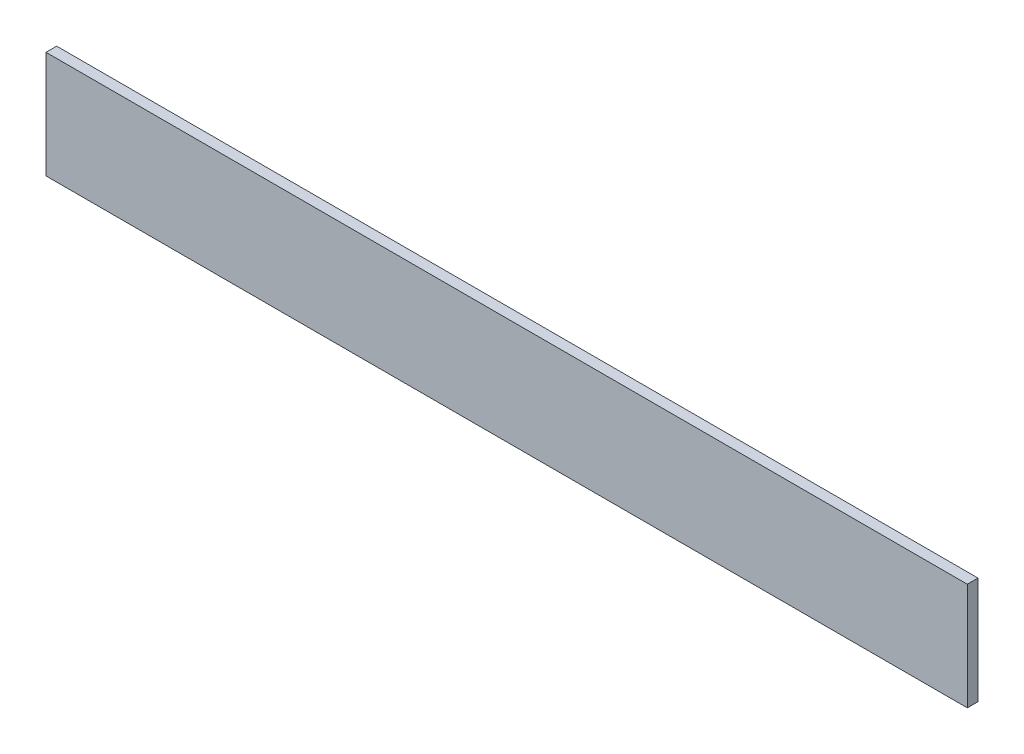
ISO-10303-21;
HEADER;
FILE_DESCRIPTION(('STEP AP214'),'2;1');
FILE_NAME('part.step','',(''),(''),'','','');
FILE_SCHEMA(('AUTOMOTIVE_DESIGN { 1 0 10303 214 1 1 1 1 }'));
ENDSEC;
DATA;
#1=APPLICATION_CONTEXT('core data for automotive mechanical design processes');
#2=APPLICATION_PROTOCOL_DEFINITION('international standard','automotive_design',2000,#1);
#3=PRODUCT_CONTEXT('',#1,'mechanical');
#4=PRODUCT('Part','Part','',(#3));
#5=PRODUCT_RELATED_PRODUCT_CATEGORY('part','',(#4));
#6=PRODUCT_DEFINITION_FORMATION('','',#4);
#7=PRODUCT_DEFINITION_CONTEXT('part definition',#1,'design');
#8=PRODUCT_DEFINITION('design','',#6,#7);
#9=PRODUCT_DEFINITION_SHAPE('','',#8);
#10=(LENGTH_UNIT() NAMED_UNIT(*) SI_UNIT(.MILLI.,.METRE.));
#11=(NAMED_UNIT(*) PLANE_ANGLE_UNIT() SI_UNIT($,.RADIAN.));
#12=(NAMED_UNIT(*) SI_UNIT($,.STERADIAN.) SOLID_ANGLE_UNIT());
#13=UNCERTAINTY_MEASURE_WITH_UNIT(LENGTH_MEASURE(1.E-05),#10,'distance_accuracy_value','');
#14=(GEOMETRIC_REPRESENTATION_CONTEXT(3) GLOBAL_UNCERTAINTY_ASSIGNED_CONTEXT((#13)) GLOBAL_UNIT_ASSIGNED_CONTEXT((#10,
#11,#12)) REPRESENTATION_CONTEXT('',''));
#15=CARTESIAN_POINT('',(0.,0.,0.));
#16=DIRECTION('',(0.,0.,1.));
#17=DIRECTION('',(1.,0.,0.));
#18=AXIS2_PLACEMENT_3D('',#15,#16,#17);
#19=CARTESIAN_POINT('',(32.574920494297,13.734089114766,2.64));
#20=DIRECTION('',(0.,0.,1.));
#21=DIRECTION('',(1.,0.,0.));
#22=AXIS2_PLACEMENT_3D('',#19,#20,#21);
#23=PLANE('',#22);
#24=DIRECTION('',(0.,1.,0.));
#25=VECTOR('',#24,1.);
#26=CARTESIAN_POINT('',(33.257948622599,17.610423854585,2.64));
#27=LINE('',#26,#25);
#28=CARTESIAN_POINT('',(33.257948622599,17.660573552284,2.64));
#29=VERTEX_POINT('',#28);
#30=CARTESIAN_POINT('',(33.257948622599,17.560274156885,2.64));
#31=VERTEX_POINT('',#30);
#32=EDGE_CURVE('E80',#29,#31,#27,.F.);
#33=ORIENTED_EDGE('',*,*,#32,.T.);
#34=DIRECTION('',(1.,0.,0.));
#35=VECTOR('',#34,1.);
#36=CARTESIAN_POINT('',(32.826434557084,17.560274156885,2.64));
#37=LINE('',#36,#35);
#38=CARTESIAN_POINT('',(32.394920491568,17.560274156885,2.64));
#39=VERTEX_POINT('',#38);
#40=EDGE_CURVE('E55',#31,#39,#37,.F.);
#41=ORIENTED_EDGE('',*,*,#40,.T.);
#42=DIRECTION('',(0.,1.,0.));
#43=VECTOR('',#42,1.);
#44=CARTESIAN_POINT('',(32.394920491568,17.610423854585,2.64));
#45=LINE('',#44,#43);
#46=CARTESIAN_POINT('',(32.394920491568,17.660573552284,2.64));
#47=VERTEX_POINT('',#46);
#48=EDGE_CURVE('E57',#39,#47,#45,.T.);
#49=ORIENTED_EDGE('',*,*,#48,.T.);
#50=DIRECTION('',(1.,0.,0.));
#51=VECTOR('',#50,1.);
#52=CARTESIAN_POINT('',(32.826434557084,17.660573552284,2.64));
#53=LINE('',#52,#51);
#54=EDGE_CURVE('E20',#47,#29,#53,.T.);
#55=ORIENTED_EDGE('',*,*,#54,.T.);
#56=EDGE_LOOP('',(#33,#41,#49,#55));
#57=FACE_BOUND('',#56,.T.);
#58=ADVANCED_FACE('F17',(#57),#23,.F.);
#59=CARTESIAN_POINT('',(32.826434557084,17.660573552284,2.64));
#60=DIRECTION('',(0.,-1.,0.));
#61=DIRECTION('',(0.,0.,-1.));
#62=AXIS2_PLACEMENT_3D('',#59,#60,#61);
#63=PLANE('',#62);
#64=DIRECTION('',(0.,0.,1.));
#65=VECTOR('',#64,1.);
#66=CARTESIAN_POINT('',(33.257948622599,17.660573552284,2.64));
#67=LINE('',#66,#65);
#68=CARTESIAN_POINT('',(33.257948622599,17.660573552284,2.65));
#69=VERTEX_POINT('',#68);
#70=EDGE_CURVE('E68',#69,#29,#67,.F.);
#71=ORIENTED_EDGE('',*,*,#70,.T.);
#72=ORIENTED_EDGE('',*,*,#54,.F.);
#73=DIRECTION('',(0.,0.,-1.));
#74=VECTOR('',#73,1.);
#75=CARTESIAN_POINT('',(32.394920491568,17.660573552284,2.64));
#76=LINE('',#75,#74);
#77=CARTESIAN_POINT('',(32.394920491568,17.660573552284,2.65));
#78=VERTEX_POINT('',#77);
#79=EDGE_CURVE('E63',#47,#78,#76,.F.);
#80=ORIENTED_EDGE('',*,*,#79,.T.);
#81=DIRECTION('',(1.,0.,0.));
#82=VECTOR('',#81,1.);
#83=CARTESIAN_POINT('',(32.574920494297,17.660573552284,2.65));
#84=LINE('',#83,#82);
#85=EDGE_CURVE('E83',#69,#78,#84,.F.);
#86=ORIENTED_EDGE('',*,*,#85,.F.);
#87=EDGE_LOOP('',(#71,#72,#80,#86));
#88=FACE_BOUND('',#87,.T.);
#89=ADVANCED_FACE('F65',(#88),#63,.F.);
#90=CARTESIAN_POINT('',(32.394920491568,17.610423854585,2.64));
#91=DIRECTION('',(1.,0.,0.));
#92=DIRECTION('',(0.,0.,-1.));
#93=AXIS2_PLACEMENT_3D('',#90,#91,#92);
#94=PLANE('',#93);
#95=ORIENTED_EDGE('',*,*,#79,.F.);
#96=ORIENTED_EDGE('',*,*,#48,.F.);
#97=DIRECTION('',(0.,0.,1.));
#98=VECTOR('',#97,1.);
#99=CARTESIAN_POINT('',(32.394920491568,17.560274156885,2.64));
#100=LINE('',#99,#98);
#101=CARTESIAN_POINT('',(32.394920491568,17.560274156885,2.65));
#102=VERTEX_POINT('',#101);
#103=EDGE_CURVE('E75',#39,#102,#100,.T.);
#104=ORIENTED_EDGE('',*,*,#103,.T.);
#105=DIRECTION('',(0.,1.,0.));
#106=VECTOR('',#105,1.);
#107=CARTESIAN_POINT('',(32.394920491568,13.734089114766,2.65));
#108=LINE('',#107,#106);
#109=EDGE_CURVE('E72',#78,#102,#108,.F.);
#110=ORIENTED_EDGE('',*,*,#109,.F.);
#111=EDGE_LOOP('',(#95,#96,#104,#110));
#112=FACE_BOUND('',#111,.T.);
#113=ADVANCED_FACE('F70',(#112),#94,.F.);
#114=CARTESIAN_POINT('',(32.826434557084,17.560274156885,2.64));
#115=DIRECTION('',(0.,1.,0.));
#116=DIRECTION('',(0.,0.,1.));
#117=AXIS2_PLACEMENT_3D('',#114,#115,#116);
#118=PLANE('',#117);
#119=ORIENTED_EDGE('',*,*,#103,.F.);
#120=ORIENTED_EDGE('',*,*,#40,.F.);
#121=DIRECTION('',(0.,0.,1.));
#122=VECTOR('',#121,1.);
#123=CARTESIAN_POINT('',(33.257948622599,17.560274156885,2.64));
#124=LINE('',#123,#122);
#125=CARTESIAN_POINT('',(33.257948622599,17.560274156885,2.65));
#126=VERTEX_POINT('',#125);
#127=EDGE_CURVE('E35',#31,#126,#124,.T.);
#128=ORIENTED_EDGE('',*,*,#127,.T.);
#129=DIRECTION('',(1.,0.,0.));
#130=VECTOR('',#129,1.);
#131=CARTESIAN_POINT('',(32.574920494297,17.560274156885,2.65));
#132=LINE('',#131,#130);
#133=EDGE_CURVE('E26',#102,#126,#132,.T.);
#134=ORIENTED_EDGE('',*,*,#133,.F.);
#135=EDGE_LOOP('',(#119,#120,#128,#134));
#136=FACE_BOUND('',#135,.T.);
#137=ADVANCED_FACE('F89',(#136),#118,.F.);
#138=CARTESIAN_POINT('',(33.257948622599,17.610423854585,2.64));
#139=DIRECTION('',(-1.,0.,0.));
#140=DIRECTION('',(0.,0.,1.));
#141=AXIS2_PLACEMENT_3D('',#138,#139,#140);
#142=PLANE('',#141);
#143=ORIENTED_EDGE('',*,*,#127,.F.);
#144=ORIENTED_EDGE('',*,*,#32,.F.);
#145=ORIENTED_EDGE('',*,*,#70,.F.);
#146=DIRECTION('',(0.,1.,0.));
#147=VECTOR('',#146,1.);
#148=CARTESIAN_POINT('',(33.257948622599,13.734089114766,2.65));
#149=LINE('',#148,#147);
#150=EDGE_CURVE('E11',#126,#69,#149,.T.);
#151=ORIENTED_EDGE('',*,*,#150,.F.);
#152=EDGE_LOOP('',(#143,#144,#145,#151));
#153=FACE_BOUND('',#152,.T.);
#154=ADVANCED_FACE('F91',(#153),#142,.F.);
#155=CARTESIAN_POINT('',(32.574920494297,13.734089114766,2.65));
#156=DIRECTION('',(0.,0.,1.));
#157=DIRECTION('',(1.,0.,0.));
#158=AXIS2_PLACEMENT_3D('',#155,#156,#157);
#159=PLANE('',#158);
#160=ORIENTED_EDGE('',*,*,#133,.T.);
#161=ORIENTED_EDGE('',*,*,#150,.T.);
#162=ORIENTED_EDGE('',*,*,#85,.T.);
#163=ORIENTED_EDGE('',*,*,#109,.T.);
#164=EDGE_LOOP('',(#160,#161,#162,#163));
#165=FACE_BOUND('',#164,.T.);
#166=ADVANCED_FACE('F88',(#165),#159,.T.);
#167=CLOSED_SHELL('',(#58,#89,#113,#137,#154,#166));
#168=MANIFOLD_SOLID_BREP('B1',#167);
#169=ADVANCED_BREP_SHAPE_REPRESENTATION('',(#18,#168),#14);
#170=SHAPE_DEFINITION_REPRESENTATION(#9,#169);
ENDSEC;
END-ISO-10303-21;
